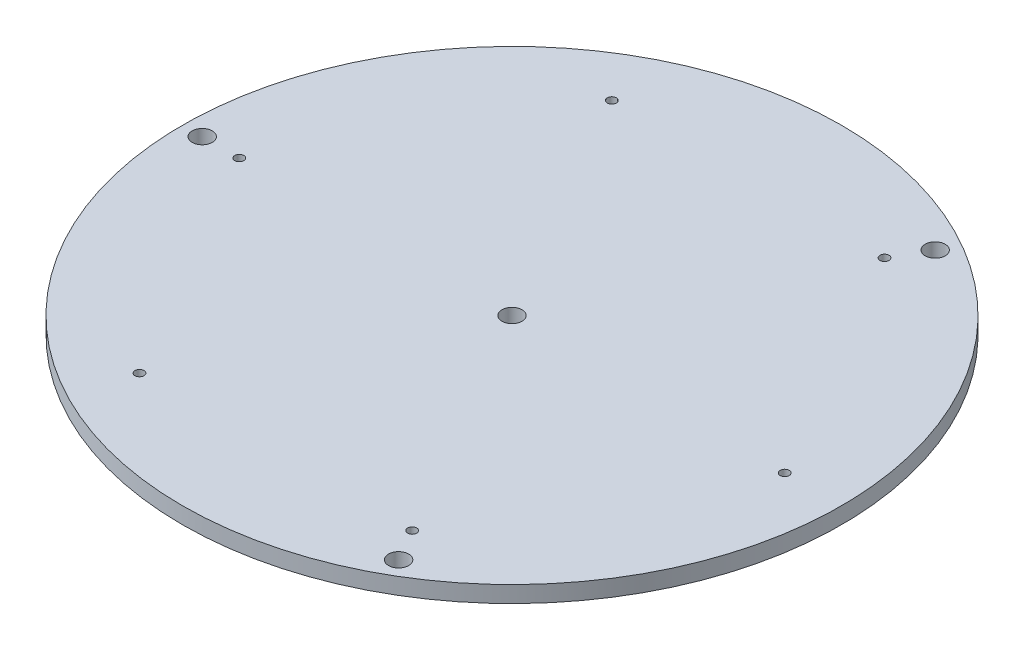
ISO-10303-21;
HEADER;
FILE_DESCRIPTION(('STEP AP214'),'2;1');
FILE_NAME('part.step','',(''),(''),'','','');
FILE_SCHEMA(('AUTOMOTIVE_DESIGN { 1 0 10303 214 1 1 1 1 }'));
ENDSEC;
DATA;
#1=APPLICATION_CONTEXT('core data for automotive mechanical design processes');
#2=APPLICATION_PROTOCOL_DEFINITION('international standard','automotive_design',2000,#1);
#3=PRODUCT_CONTEXT('',#1,'mechanical');
#4=PRODUCT('Part','Part','',(#3));
#5=PRODUCT_RELATED_PRODUCT_CATEGORY('part','',(#4));
#6=PRODUCT_DEFINITION_FORMATION('','',#4);
#7=PRODUCT_DEFINITION_CONTEXT('part definition',#1,'design');
#8=PRODUCT_DEFINITION('design','',#6,#7);
#9=PRODUCT_DEFINITION_SHAPE('','',#8);
#10=(LENGTH_UNIT() NAMED_UNIT(*) SI_UNIT(.MILLI.,.METRE.));
#11=(NAMED_UNIT(*) PLANE_ANGLE_UNIT() SI_UNIT($,.RADIAN.));
#12=(NAMED_UNIT(*) SI_UNIT($,.STERADIAN.) SOLID_ANGLE_UNIT());
#13=UNCERTAINTY_MEASURE_WITH_UNIT(LENGTH_MEASURE(1.E-05),#10,'distance_accuracy_value','');
#14=(GEOMETRIC_REPRESENTATION_CONTEXT(3) GLOBAL_UNCERTAINTY_ASSIGNED_CONTEXT((#13)) GLOBAL_UNIT_ASSIGNED_CONTEXT((#10,
#11,#12)) REPRESENTATION_CONTEXT('',''));
#15=CARTESIAN_POINT('',(0.,0.,0.));
#16=DIRECTION('',(0.,0.,1.));
#17=DIRECTION('',(1.,0.,0.));
#18=AXIS2_PLACEMENT_3D('',#15,#16,#17);
#19=CARTESIAN_POINT('',(0.,10.,0.));
#20=DIRECTION('',(0.,1.,0.));
#21=DIRECTION('',(0.,0.,1.));
#22=AXIS2_PLACEMENT_3D('',#19,#20,#21);
#23=PLANE('',#22);
#24=CARTESIAN_POINT('',(-82.7500000000017,10.,-143.327204326324));
#25=DIRECTION('',(0.,1.,0.));
#26=DIRECTION('',(-0.866025403784433,0.,0.50000000000001));
#27=AXIS2_PLACEMENT_3D('',#24,#25,#26);
#28=CIRCLE('',#27,2.75000000000001);
#29=CARTESIAN_POINT('',(-85.1315698604089,10.,-141.952204326324));
#30=VERTEX_POINT('',#29);
#31=EDGE_CURVE('E100',#30,#30,#28,.T.);
#32=ORIENTED_EDGE('',*,*,#31,.F.);
#33=EDGE_LOOP('',(#32));
#34=FACE_BOUND('',#33,.T.);
#35=CARTESIAN_POINT('',(82.7499999999987,10.,-143.327204326325));
#36=DIRECTION('',(0.,1.,0.));
#37=DIRECTION('',(-0.866025403784443,0.,-0.499999999999992));
#38=AXIS2_PLACEMENT_3D('',#35,#36,#37);
#39=CIRCLE('',#38,2.75000000000001);
#40=CARTESIAN_POINT('',(80.3684301395914,10.,-144.702204326325));
#41=VERTEX_POINT('',#40);
#42=EDGE_CURVE('E108',#41,#41,#39,.T.);
#43=ORIENTED_EDGE('',*,*,#42,.F.);
#44=EDGE_LOOP('',(#43));
#45=FACE_BOUND('',#44,.T.);
#46=CARTESIAN_POINT('',(165.5,10.,0.));
#47=DIRECTION('',(0.,1.,0.));
#48=DIRECTION('',(0.,0.,-1.));
#49=AXIS2_PLACEMENT_3D('',#46,#47,#48);
#50=CIRCLE('',#49,2.75000000000001);
#51=CARTESIAN_POINT('',(165.5,10.,-2.75000000000001));
#52=VERTEX_POINT('',#51);
#53=EDGE_CURVE('E116',#52,#52,#50,.T.);
#54=ORIENTED_EDGE('',*,*,#53,.F.);
#55=EDGE_LOOP('',(#54));
#56=FACE_BOUND('',#55,.T.);
#57=CARTESIAN_POINT('',(82.7500000000007,10.,143.327204326324));
#58=DIRECTION('',(0.,1.,0.));
#59=DIRECTION('',(0.866025403784436,0.,-0.500000000000004));
#60=AXIS2_PLACEMENT_3D('',#57,#58,#59);
#61=CIRCLE('',#60,2.75000000000001);
#62=CARTESIAN_POINT('',(85.1315698604079,10.,141.952204326324));
#63=VERTEX_POINT('',#62);
#64=EDGE_CURVE('E124',#63,#63,#61,.T.);
#65=ORIENTED_EDGE('',*,*,#64,.F.);
#66=EDGE_LOOP('',(#65));
#67=FACE_BOUND('',#66,.T.);
#68=CARTESIAN_POINT('',(-82.7499999999997,10.,143.327204326325));
#69=DIRECTION('',(0.,1.,0.));
#70=DIRECTION('',(0.86602540378444,0.,0.499999999999998));
#71=AXIS2_PLACEMENT_3D('',#68,#69,#70);
#72=CIRCLE('',#71,2.75000000000001);
#73=CARTESIAN_POINT('',(-80.3684301395924,10.,144.702204326325));
#74=VERTEX_POINT('',#73);
#75=EDGE_CURVE('E92',#74,#74,#72,.T.);
#76=ORIENTED_EDGE('',*,*,#75,.F.);
#77=EDGE_LOOP('',(#76));
#78=FACE_BOUND('',#77,.T.);
#79=CARTESIAN_POINT('',(-165.5,10.,0.));
#80=DIRECTION('',(0.,1.,0.));
#81=DIRECTION('',(0.,0.,1.));
#82=AXIS2_PLACEMENT_3D('',#79,#80,#81);
#83=CIRCLE('',#82,2.75000000000001);
#84=CARTESIAN_POINT('',(-165.5,10.,2.75000000000001));
#85=VERTEX_POINT('',#84);
#86=EDGE_CURVE('E84',#85,#85,#83,.T.);
#87=ORIENTED_EDGE('',*,*,#86,.F.);
#88=EDGE_LOOP('',(#87));
#89=FACE_BOUND('',#88,.T.);
#90=CARTESIAN_POINT('',(94.0000000000008,10.,162.812775911474));
#91=DIRECTION('',(0.,1.,0.));
#92=DIRECTION('',(0.866025403784436,0.,-0.500000000000004));
#93=AXIS2_PLACEMENT_3D('',#90,#91,#92);
#94=CIRCLE('',#93,6.09999999999998);
#95=CARTESIAN_POINT('',(99.2827549630858,10.,159.762775911474));
#96=VERTEX_POINT('',#95);
#97=EDGE_CURVE('E77',#96,#96,#94,.T.);
#98=ORIENTED_EDGE('',*,*,#97,.F.);
#99=EDGE_LOOP('',(#98));
#100=FACE_BOUND('',#99,.T.);
#101=CARTESIAN_POINT('',(93.9999999999985,10.,-162.812775911475));
#102=DIRECTION('',(0.,1.,0.));
#103=DIRECTION('',(-0.866025403784443,0.,-0.499999999999992));
#104=AXIS2_PLACEMENT_3D('',#101,#102,#103);
#105=CIRCLE('',#104,6.09999999999998);
#106=CARTESIAN_POINT('',(88.7172450369134,10.,-165.862775911475));
#107=VERTEX_POINT('',#106);
#108=EDGE_CURVE('E68',#107,#107,#105,.T.);
#109=ORIENTED_EDGE('',*,*,#108,.F.);
#110=EDGE_LOOP('',(#109));
#111=FACE_BOUND('',#110,.T.);
#112=CARTESIAN_POINT('',(-188.,10.,0.));
#113=DIRECTION('',(0.,1.,0.));
#114=DIRECTION('',(0.,0.,1.));
#115=AXIS2_PLACEMENT_3D('',#112,#113,#114);
#116=CIRCLE('',#115,6.09999999999998);
#117=CARTESIAN_POINT('',(-188.,10.,6.09999999999998));
#118=VERTEX_POINT('',#117);
#119=EDGE_CURVE('E60',#118,#118,#116,.T.);
#120=ORIENTED_EDGE('',*,*,#119,.F.);
#121=EDGE_LOOP('',(#120));
#122=FACE_BOUND('',#121,.T.);
#123=CARTESIAN_POINT('',(0.,10.,0.));
#124=DIRECTION('',(0.,1.,0.));
#125=DIRECTION('',(0.,0.,1.));
#126=AXIS2_PLACEMENT_3D('',#123,#124,#125);
#127=CIRCLE('',#126,200.);
#128=CARTESIAN_POINT('',(0.,10.,200.));
#129=VERTEX_POINT('',#128);
#130=EDGE_CURVE('E10',#129,#129,#127,.T.);
#131=ORIENTED_EDGE('',*,*,#130,.T.);
#132=EDGE_LOOP('',(#131));
#133=FACE_BOUND('',#132,.T.);
#134=CARTESIAN_POINT('',(0.,10.,0.));
#135=DIRECTION('',(0.,1.,0.));
#136=DIRECTION('',(0.,0.,1.));
#137=AXIS2_PLACEMENT_3D('',#134,#135,#136);
#138=CIRCLE('',#137,6.1);
#139=CARTESIAN_POINT('',(0.,10.,6.1));
#140=VERTEX_POINT('',#139);
#141=EDGE_CURVE('E50',#140,#140,#138,.T.);
#142=ORIENTED_EDGE('',*,*,#141,.F.);
#143=EDGE_LOOP('',(#142));
#144=FACE_BOUND('',#143,.T.);
#145=ADVANCED_FACE('F37',(#34,#45,#56,#67,#78,#89,#100,#111,#122,#133,#144),#23,.T.);
#146=CARTESIAN_POINT('',(0.,0.,0.));
#147=DIRECTION('',(0.,1.,0.));
#148=DIRECTION('',(0.,0.,1.));
#149=AXIS2_PLACEMENT_3D('',#146,#147,#148);
#150=PLANE('',#149);
#151=CARTESIAN_POINT('',(-82.7500000000017,0.,-143.327204326324));
#152=DIRECTION('',(0.,1.,0.));
#153=DIRECTION('',(-0.866025403784433,0.,0.50000000000001));
#154=AXIS2_PLACEMENT_3D('',#151,#152,#153);
#155=CIRCLE('',#154,2.75000000000001);
#156=CARTESIAN_POINT('',(-85.1315698604089,0.,-141.952204326324));
#157=VERTEX_POINT('',#156);
#158=EDGE_CURVE('E104',#157,#157,#155,.T.);
#159=ORIENTED_EDGE('',*,*,#158,.T.);
#160=EDGE_LOOP('',(#159));
#161=FACE_BOUND('',#160,.T.);
#162=CARTESIAN_POINT('',(82.7499999999987,0.,-143.327204326325));
#163=DIRECTION('',(0.,1.,0.));
#164=DIRECTION('',(-0.866025403784443,0.,-0.499999999999992));
#165=AXIS2_PLACEMENT_3D('',#162,#163,#164);
#166=CIRCLE('',#165,2.75000000000001);
#167=CARTESIAN_POINT('',(80.3684301395914,0.,-144.702204326325));
#168=VERTEX_POINT('',#167);
#169=EDGE_CURVE('E112',#168,#168,#166,.T.);
#170=ORIENTED_EDGE('',*,*,#169,.T.);
#171=EDGE_LOOP('',(#170));
#172=FACE_BOUND('',#171,.T.);
#173=CARTESIAN_POINT('',(165.5,0.,0.));
#174=DIRECTION('',(0.,1.,0.));
#175=DIRECTION('',(0.,0.,-1.));
#176=AXIS2_PLACEMENT_3D('',#173,#174,#175);
#177=CIRCLE('',#176,2.75000000000001);
#178=CARTESIAN_POINT('',(165.5,0.,-2.75000000000001));
#179=VERTEX_POINT('',#178);
#180=EDGE_CURVE('E120',#179,#179,#177,.T.);
#181=ORIENTED_EDGE('',*,*,#180,.T.);
#182=EDGE_LOOP('',(#181));
#183=FACE_BOUND('',#182,.T.);
#184=CARTESIAN_POINT('',(82.7500000000007,0.,143.327204326324));
#185=DIRECTION('',(0.,1.,0.));
#186=DIRECTION('',(0.866025403784436,0.,-0.500000000000004));
#187=AXIS2_PLACEMENT_3D('',#184,#185,#186);
#188=CIRCLE('',#187,2.75000000000001);
#189=CARTESIAN_POINT('',(85.1315698604079,0.,141.952204326324));
#190=VERTEX_POINT('',#189);
#191=EDGE_CURVE('E96',#190,#190,#188,.T.);
#192=ORIENTED_EDGE('',*,*,#191,.T.);
#193=EDGE_LOOP('',(#192));
#194=FACE_BOUND('',#193,.T.);
#195=CARTESIAN_POINT('',(-82.7499999999997,0.,143.327204326325));
#196=DIRECTION('',(0.,1.,0.));
#197=DIRECTION('',(0.86602540378444,0.,0.499999999999998));
#198=AXIS2_PLACEMENT_3D('',#195,#196,#197);
#199=CIRCLE('',#198,2.75000000000001);
#200=CARTESIAN_POINT('',(-80.3684301395924,0.,144.702204326325));
#201=VERTEX_POINT('',#200);
#202=EDGE_CURVE('E88',#201,#201,#199,.T.);
#203=ORIENTED_EDGE('',*,*,#202,.T.);
#204=EDGE_LOOP('',(#203));
#205=FACE_BOUND('',#204,.T.);
#206=CARTESIAN_POINT('',(-165.5,0.,0.));
#207=DIRECTION('',(0.,1.,0.));
#208=DIRECTION('',(0.,0.,1.));
#209=AXIS2_PLACEMENT_3D('',#206,#207,#208);
#210=CIRCLE('',#209,2.75000000000001);
#211=CARTESIAN_POINT('',(-165.5,0.,2.75000000000001));
#212=VERTEX_POINT('',#211);
#213=EDGE_CURVE('E73',#212,#212,#210,.T.);
#214=ORIENTED_EDGE('',*,*,#213,.T.);
#215=EDGE_LOOP('',(#214));
#216=FACE_BOUND('',#215,.T.);
#217=CARTESIAN_POINT('',(94.0000000000008,0.,162.812775911474));
#218=DIRECTION('',(0.,1.,0.));
#219=DIRECTION('',(0.866025403784436,0.,-0.500000000000004));
#220=AXIS2_PLACEMENT_3D('',#217,#218,#219);
#221=CIRCLE('',#220,6.09999999999998);
#222=CARTESIAN_POINT('',(99.2827549630858,0.,159.762775911474));
#223=VERTEX_POINT('',#222);
#224=EDGE_CURVE('E64',#223,#223,#221,.T.);
#225=ORIENTED_EDGE('',*,*,#224,.T.);
#226=EDGE_LOOP('',(#225));
#227=FACE_BOUND('',#226,.T.);
#228=CARTESIAN_POINT('',(93.9999999999985,0.,-162.812775911475));
#229=DIRECTION('',(0.,1.,0.));
#230=DIRECTION('',(-0.866025403784443,0.,-0.499999999999992));
#231=AXIS2_PLACEMENT_3D('',#228,#229,#230);
#232=CIRCLE('',#231,6.09999999999998);
#233=CARTESIAN_POINT('',(88.7172450369134,0.,-165.862775911475));
#234=VERTEX_POINT('',#233);
#235=EDGE_CURVE('E72',#234,#234,#232,.T.);
#236=ORIENTED_EDGE('',*,*,#235,.T.);
#237=EDGE_LOOP('',(#236));
#238=FACE_BOUND('',#237,.T.);
#239=CARTESIAN_POINT('',(-188.,0.,0.));
#240=DIRECTION('',(0.,1.,0.));
#241=DIRECTION('',(0.,0.,1.));
#242=AXIS2_PLACEMENT_3D('',#239,#240,#241);
#243=CIRCLE('',#242,6.09999999999998);
#244=CARTESIAN_POINT('',(-188.,0.,6.09999999999998));
#245=VERTEX_POINT('',#244);
#246=EDGE_CURVE('E56',#245,#245,#243,.T.);
#247=ORIENTED_EDGE('',*,*,#246,.T.);
#248=EDGE_LOOP('',(#247));
#249=FACE_BOUND('',#248,.T.);
#250=CARTESIAN_POINT('',(0.,0.,0.));
#251=DIRECTION('',(0.,1.,0.));
#252=DIRECTION('',(0.,0.,1.));
#253=AXIS2_PLACEMENT_3D('',#250,#251,#252);
#254=CIRCLE('',#253,200.);
#255=CARTESIAN_POINT('',(0.,0.,200.));
#256=VERTEX_POINT('',#255);
#257=EDGE_CURVE('E41',#256,#256,#254,.T.);
#258=ORIENTED_EDGE('',*,*,#257,.F.);
#259=EDGE_LOOP('',(#258));
#260=FACE_BOUND('',#259,.T.);
#261=CARTESIAN_POINT('',(0.,0.,0.));
#262=DIRECTION('',(0.,1.,0.));
#263=DIRECTION('',(0.,0.,1.));
#264=AXIS2_PLACEMENT_3D('',#261,#262,#263);
#265=CIRCLE('',#264,6.1);
#266=CARTESIAN_POINT('',(0.,0.,6.1));
#267=VERTEX_POINT('',#266);
#268=EDGE_CURVE('E52',#267,#267,#265,.T.);
#269=ORIENTED_EDGE('',*,*,#268,.T.);
#270=EDGE_LOOP('',(#269));
#271=FACE_BOUND('',#270,.T.);
#272=ADVANCED_FACE('F132',(#161,#172,#183,#194,#205,#216,#227,#238,#249,#260,#271),#150,.F.);
#273=CARTESIAN_POINT('',(0.,10.,0.));
#274=DIRECTION('',(0.,-1.,0.));
#275=DIRECTION('',(0.,0.,-1.));
#276=AXIS2_PLACEMENT_3D('',#273,#274,#275);
#277=CYLINDRICAL_SURFACE('',#276,200.);
#278=ORIENTED_EDGE('',*,*,#130,.F.);
#279=EDGE_LOOP('',(#278));
#280=FACE_BOUND('',#279,.T.);
#281=ORIENTED_EDGE('',*,*,#257,.T.);
#282=EDGE_LOOP('',(#281));
#283=FACE_BOUND('',#282,.T.);
#284=ADVANCED_FACE('F39',(#280,#283),#277,.T.);
#285=CARTESIAN_POINT('',(0.,10.,0.));
#286=DIRECTION('',(0.,-1.,0.));
#287=DIRECTION('',(0.,0.,-1.));
#288=AXIS2_PLACEMENT_3D('',#285,#286,#287);
#289=CYLINDRICAL_SURFACE('',#288,6.1);
#290=ORIENTED_EDGE('',*,*,#141,.T.);
#291=EDGE_LOOP('',(#290));
#292=FACE_BOUND('',#291,.T.);
#293=ORIENTED_EDGE('',*,*,#268,.F.);
#294=EDGE_LOOP('',(#293));
#295=FACE_BOUND('',#294,.T.);
#296=ADVANCED_FACE('F159',(#292,#295),#289,.F.);
#297=CARTESIAN_POINT('',(-188.,0.,0.));
#298=DIRECTION('',(0.,1.,0.));
#299=DIRECTION('',(0.,0.,1.));
#300=AXIS2_PLACEMENT_3D('',#297,#298,#299);
#301=CYLINDRICAL_SURFACE('',#300,6.09999999999998);
#302=ORIENTED_EDGE('',*,*,#246,.F.);
#303=EDGE_LOOP('',(#302));
#304=FACE_BOUND('',#303,.T.);
#305=ORIENTED_EDGE('',*,*,#119,.T.);
#306=EDGE_LOOP('',(#305));
#307=FACE_BOUND('',#306,.T.);
#308=ADVANCED_FACE('F162',(#304,#307),#301,.F.);
#309=CARTESIAN_POINT('',(93.9999999999985,0.,-162.812775911475));
#310=DIRECTION('',(0.,1.,0.));
#311=DIRECTION('',(0.,0.,1.));
#312=AXIS2_PLACEMENT_3D('',#309,#310,#311);
#313=CYLINDRICAL_SURFACE('',#312,6.09999999999998);
#314=ORIENTED_EDGE('',*,*,#235,.F.);
#315=EDGE_LOOP('',(#314));
#316=FACE_BOUND('',#315,.T.);
#317=ORIENTED_EDGE('',*,*,#108,.T.);
#318=EDGE_LOOP('',(#317));
#319=FACE_BOUND('',#318,.T.);
#320=ADVANCED_FACE('F176',(#316,#319),#313,.F.);
#321=CARTESIAN_POINT('',(94.0000000000008,0.,162.812775911474));
#322=DIRECTION('',(0.,1.,0.));
#323=DIRECTION('',(0.,0.,1.));
#324=AXIS2_PLACEMENT_3D('',#321,#322,#323);
#325=CYLINDRICAL_SURFACE('',#324,6.09999999999998);
#326=ORIENTED_EDGE('',*,*,#224,.F.);
#327=EDGE_LOOP('',(#326));
#328=FACE_BOUND('',#327,.T.);
#329=ORIENTED_EDGE('',*,*,#97,.T.);
#330=EDGE_LOOP('',(#329));
#331=FACE_BOUND('',#330,.T.);
#332=ADVANCED_FACE('F180',(#328,#331),#325,.F.);
#333=CARTESIAN_POINT('',(-165.5,0.,0.));
#334=DIRECTION('',(0.,1.,0.));
#335=DIRECTION('',(0.,0.,1.));
#336=AXIS2_PLACEMENT_3D('',#333,#334,#335);
#337=CYLINDRICAL_SURFACE('',#336,2.75000000000001);
#338=ORIENTED_EDGE('',*,*,#213,.F.);
#339=EDGE_LOOP('',(#338));
#340=FACE_BOUND('',#339,.T.);
#341=ORIENTED_EDGE('',*,*,#86,.T.);
#342=EDGE_LOOP('',(#341));
#343=FACE_BOUND('',#342,.T.);
#344=ADVANCED_FACE('F184',(#340,#343),#337,.F.);
#345=CARTESIAN_POINT('',(-82.7499999999997,0.,143.327204326325));
#346=DIRECTION('',(0.,1.,0.));
#347=DIRECTION('',(0.,0.,1.));
#348=AXIS2_PLACEMENT_3D('',#345,#346,#347);
#349=CYLINDRICAL_SURFACE('',#348,2.75000000000001);
#350=ORIENTED_EDGE('',*,*,#202,.F.);
#351=EDGE_LOOP('',(#350));
#352=FACE_BOUND('',#351,.T.);
#353=ORIENTED_EDGE('',*,*,#75,.T.);
#354=EDGE_LOOP('',(#353));
#355=FACE_BOUND('',#354,.T.);
#356=ADVANCED_FACE('F139',(#352,#355),#349,.F.);
#357=CARTESIAN_POINT('',(82.7500000000007,0.,143.327204326324));
#358=DIRECTION('',(0.,1.,0.));
#359=DIRECTION('',(0.,0.,1.));
#360=AXIS2_PLACEMENT_3D('',#357,#358,#359);
#361=CYLINDRICAL_SURFACE('',#360,2.75000000000001);
#362=ORIENTED_EDGE('',*,*,#191,.F.);
#363=EDGE_LOOP('',(#362));
#364=FACE_BOUND('',#363,.T.);
#365=ORIENTED_EDGE('',*,*,#64,.T.);
#366=EDGE_LOOP('',(#365));
#367=FACE_BOUND('',#366,.T.);
#368=ADVANCED_FACE('F135',(#364,#367),#361,.F.);
#369=CARTESIAN_POINT('',(165.5,0.,0.));
#370=DIRECTION('',(0.,1.,0.));
#371=DIRECTION('',(0.,0.,1.));
#372=AXIS2_PLACEMENT_3D('',#369,#370,#371);
#373=CYLINDRICAL_SURFACE('',#372,2.75000000000001);
#374=ORIENTED_EDGE('',*,*,#180,.F.);
#375=EDGE_LOOP('',(#374));
#376=FACE_BOUND('',#375,.T.);
#377=ORIENTED_EDGE('',*,*,#53,.T.);
#378=EDGE_LOOP('',(#377));
#379=FACE_BOUND('',#378,.T.);
#380=ADVANCED_FACE('F138',(#376,#379),#373,.F.);
#381=CARTESIAN_POINT('',(82.7499999999987,0.,-143.327204326325));
#382=DIRECTION('',(0.,1.,0.));
#383=DIRECTION('',(0.,0.,1.));
#384=AXIS2_PLACEMENT_3D('',#381,#382,#383);
#385=CYLINDRICAL_SURFACE('',#384,2.75000000000001);
#386=ORIENTED_EDGE('',*,*,#169,.F.);
#387=EDGE_LOOP('',(#386));
#388=FACE_BOUND('',#387,.T.);
#389=ORIENTED_EDGE('',*,*,#42,.T.);
#390=EDGE_LOOP('',(#389));
#391=FACE_BOUND('',#390,.T.);
#392=ADVANCED_FACE('F195',(#388,#391),#385,.F.);
#393=CARTESIAN_POINT('',(-82.7500000000017,0.,-143.327204326324));
#394=DIRECTION('',(0.,1.,0.));
#395=DIRECTION('',(0.,0.,1.));
#396=AXIS2_PLACEMENT_3D('',#393,#394,#395);
#397=CYLINDRICAL_SURFACE('',#396,2.75000000000001);
#398=ORIENTED_EDGE('',*,*,#158,.F.);
#399=EDGE_LOOP('',(#398));
#400=FACE_BOUND('',#399,.T.);
#401=ORIENTED_EDGE('',*,*,#31,.T.);
#402=EDGE_LOOP('',(#401));
#403=FACE_BOUND('',#402,.T.);
#404=ADVANCED_FACE('F192',(#400,#403),#397,.F.);
#405=CLOSED_SHELL('',(#145,#272,#284,#296,#308,#320,#332,#344,#356,#368,#380,#392,#404));
#406=MANIFOLD_SOLID_BREP('B2',#405);
#407=ADVANCED_BREP_SHAPE_REPRESENTATION('',(#18,#406),#14);
#408=SHAPE_DEFINITION_REPRESENTATION(#9,#407);
ENDSEC;
END-ISO-10303-21;
